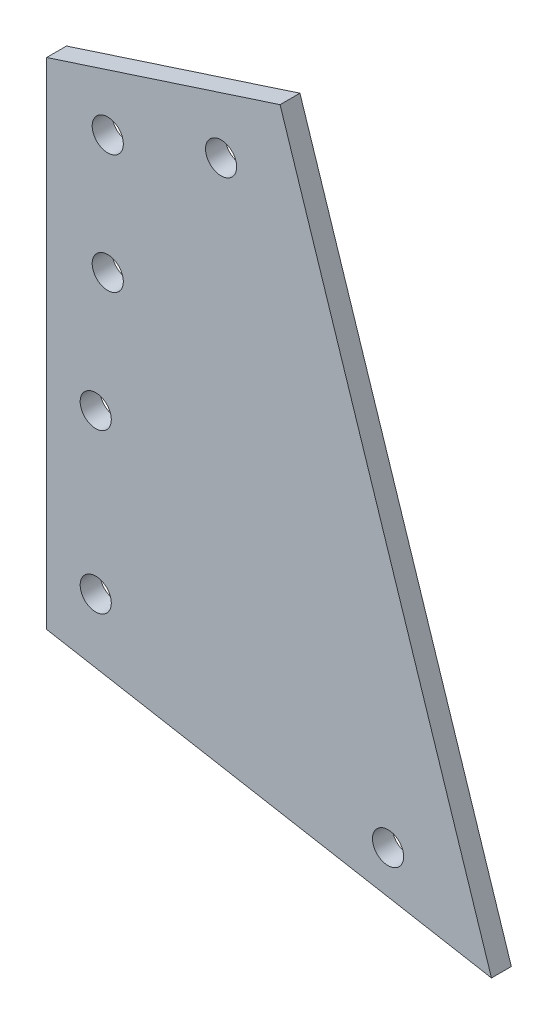
ISO-10303-21;
HEADER;
FILE_DESCRIPTION(('STEP AP214'),'2;1');
FILE_NAME('part.step','',(''),(''),'','','');
FILE_SCHEMA(('AUTOMOTIVE_DESIGN { 1 0 10303 214 1 1 1 1 }'));
ENDSEC;
DATA;
#1=APPLICATION_CONTEXT('core data for automotive mechanical design processes');
#2=APPLICATION_PROTOCOL_DEFINITION('international standard','automotive_design',2000,#1);
#3=PRODUCT_CONTEXT('',#1,'mechanical');
#4=PRODUCT('Part','Part','',(#3));
#5=PRODUCT_RELATED_PRODUCT_CATEGORY('part','',(#4));
#6=PRODUCT_DEFINITION_FORMATION('','',#4);
#7=PRODUCT_DEFINITION_CONTEXT('part definition',#1,'design');
#8=PRODUCT_DEFINITION('design','',#6,#7);
#9=PRODUCT_DEFINITION_SHAPE('','',#8);
#10=(LENGTH_UNIT() NAMED_UNIT(*) SI_UNIT(.MILLI.,.METRE.));
#11=(NAMED_UNIT(*) PLANE_ANGLE_UNIT() SI_UNIT($,.RADIAN.));
#12=(NAMED_UNIT(*) SI_UNIT($,.STERADIAN.) SOLID_ANGLE_UNIT());
#13=UNCERTAINTY_MEASURE_WITH_UNIT(LENGTH_MEASURE(1.E-05),#10,'distance_accuracy_value','');
#14=(GEOMETRIC_REPRESENTATION_CONTEXT(3) GLOBAL_UNCERTAINTY_ASSIGNED_CONTEXT((#13)) GLOBAL_UNIT_ASSIGNED_CONTEXT((#10,
#11,#12)) REPRESENTATION_CONTEXT('',''));
#15=CARTESIAN_POINT('',(0.,0.,0.));
#16=DIRECTION('',(0.,0.,1.));
#17=DIRECTION('',(1.,0.,0.));
#18=AXIS2_PLACEMENT_3D('',#15,#16,#17);
#19=CARTESIAN_POINT('',(42.1693063627355,295.217137728913,3.175));
#20=DIRECTION('',(0.309016994375065,-0.951056516295115,0.));
#21=DIRECTION('',(0.951056516295115,0.309016994375065,0.));
#22=AXIS2_PLACEMENT_3D('',#19,#20,#21);
#23=PLANE('',#22);
#24=DIRECTION('',(-0.951056516295115,-0.309016994375065,0.));
#25=VECTOR('',#24,1.);
#26=CARTESIAN_POINT('',(42.1693063627355,295.217137728913,0.));
#27=LINE('',#26,#25);
#28=CARTESIAN_POINT('',(42.1693063627355,295.217137728913,0.));
#29=VERTEX_POINT('',#28);
#30=CARTESIAN_POINT('',(4.85420955230369,283.092727808361,0.));
#31=VERTEX_POINT('',#30);
#32=EDGE_CURVE('E100',#29,#31,#27,.T.);
#33=ORIENTED_EDGE('',*,*,#32,.T.);
#34=DIRECTION('',(0.,0.,-1.));
#35=VECTOR('',#34,1.);
#36=CARTESIAN_POINT('',(4.85420955230369,283.092727808361,3.175));
#37=LINE('',#36,#35);
#38=CARTESIAN_POINT('',(4.85420955230369,283.092727808361,3.175));
#39=VERTEX_POINT('',#38);
#40=EDGE_CURVE('E11',#39,#31,#37,.T.);
#41=ORIENTED_EDGE('',*,*,#40,.F.);
#42=DIRECTION('',(-0.951056516295115,-0.309016994375065,0.));
#43=VECTOR('',#42,1.);
#44=CARTESIAN_POINT('',(42.1693063627355,295.217137728913,3.175));
#45=LINE('',#44,#43);
#46=CARTESIAN_POINT('',(42.1693063627355,295.217137728913,3.175));
#47=VERTEX_POINT('',#46);
#48=EDGE_CURVE('E88',#47,#39,#45,.T.);
#49=ORIENTED_EDGE('',*,*,#48,.F.);
#50=DIRECTION('',(0.,0.,-1.));
#51=VECTOR('',#50,1.);
#52=CARTESIAN_POINT('',(42.1693063627355,295.217137728913,3.175));
#53=LINE('',#52,#51);
#54=EDGE_CURVE('E96',#47,#29,#53,.T.);
#55=ORIENTED_EDGE('',*,*,#54,.T.);
#56=EDGE_LOOP('',(#33,#41,#49,#55));
#57=FACE_BOUND('',#56,.T.);
#58=ADVANCED_FACE('F37',(#57),#23,.F.);
#59=CARTESIAN_POINT('',(4.85420955230369,283.092727808361,3.175));
#60=DIRECTION('',(1.,0.,0.));
#61=DIRECTION('',(0.,1.,0.));
#62=AXIS2_PLACEMENT_3D('',#59,#60,#61);
#63=PLANE('',#62);
#64=DIRECTION('',(0.,-1.,0.));
#65=VECTOR('',#64,1.);
#66=CARTESIAN_POINT('',(4.85420955230369,283.092727808361,0.));
#67=LINE('',#66,#65);
#68=CARTESIAN_POINT('',(4.8542095523037,203.901454103905,0.));
#69=VERTEX_POINT('',#68);
#70=EDGE_CURVE('E92',#31,#69,#67,.T.);
#71=ORIENTED_EDGE('',*,*,#70,.T.);
#72=DIRECTION('',(0.,0.,-1.));
#73=VECTOR('',#72,1.);
#74=CARTESIAN_POINT('',(4.8542095523037,203.901454103905,3.175));
#75=LINE('',#74,#73);
#76=CARTESIAN_POINT('',(4.8542095523037,203.901454103905,3.175));
#77=VERTEX_POINT('',#76);
#78=EDGE_CURVE('E45',#77,#69,#75,.T.);
#79=ORIENTED_EDGE('',*,*,#78,.F.);
#80=DIRECTION('',(0.,-1.,0.));
#81=VECTOR('',#80,1.);
#82=CARTESIAN_POINT('',(4.85420955230369,283.092727808361,3.175));
#83=LINE('',#82,#81);
#84=EDGE_CURVE('E83',#39,#77,#83,.T.);
#85=ORIENTED_EDGE('',*,*,#84,.F.);
#86=ORIENTED_EDGE('',*,*,#40,.T.);
#87=EDGE_LOOP('',(#71,#79,#85,#86));
#88=FACE_BOUND('',#87,.T.);
#89=ADVANCED_FACE('F91',(#88),#63,.F.);
#90=CARTESIAN_POINT('',(4.8542095523037,203.901454103905,3.175));
#91=DIRECTION('',(0.17581018406846,0.984424085025257,0.));
#92=DIRECTION('',(-0.984424085025257,0.17581018406846,0.));
#93=AXIS2_PLACEMENT_3D('',#90,#91,#92);
#94=PLANE('',#93);
#95=DIRECTION('',(0.984424085025257,-0.17581018406846,0.));
#96=VECTOR('',#95,1.);
#97=CARTESIAN_POINT('',(4.8542095523037,203.901454103905,0.));
#98=LINE('',#97,#96);
#99=CARTESIAN_POINT('',(75.9660506896394,191.201454103924,0.));
#100=VERTEX_POINT('',#99);
#101=EDGE_CURVE('E70',#69,#100,#98,.T.);
#102=ORIENTED_EDGE('',*,*,#101,.T.);
#103=DIRECTION('',(0.,0.,-1.));
#104=VECTOR('',#103,1.);
#105=CARTESIAN_POINT('',(75.9660506896394,191.201454103924,3.175));
#106=LINE('',#105,#104);
#107=CARTESIAN_POINT('',(75.9660506896394,191.201454103924,3.175));
#108=VERTEX_POINT('',#107);
#109=EDGE_CURVE('E93',#108,#100,#106,.T.);
#110=ORIENTED_EDGE('',*,*,#109,.F.);
#111=DIRECTION('',(0.984424085025257,-0.17581018406846,0.));
#112=VECTOR('',#111,1.);
#113=CARTESIAN_POINT('',(4.8542095523037,203.901454103905,3.175));
#114=LINE('',#113,#112);
#115=EDGE_CURVE('E86',#77,#108,#114,.T.);
#116=ORIENTED_EDGE('',*,*,#115,.F.);
#117=ORIENTED_EDGE('',*,*,#78,.T.);
#118=EDGE_LOOP('',(#102,#110,#116,#117));
#119=FACE_BOUND('',#118,.T.);
#120=ADVANCED_FACE('F94',(#119),#94,.F.);
#121=CARTESIAN_POINT('',(75.9660506896394,191.201454103924,3.175));
#122=DIRECTION('',(-0.951056516295116,-0.309016994375065,0.));
#123=DIRECTION('',(0.309016994375065,-0.951056516295116,0.));
#124=AXIS2_PLACEMENT_3D('',#121,#122,#123);
#125=PLANE('',#124);
#126=DIRECTION('',(-0.309016994375065,0.951056516295115,0.));
#127=VECTOR('',#126,1.);
#128=CARTESIAN_POINT('',(75.9660506896394,191.201454103924,0.));
#129=LINE('',#128,#127);
#130=EDGE_CURVE('E76',#100,#29,#129,.T.);
#131=ORIENTED_EDGE('',*,*,#130,.T.);
#132=ORIENTED_EDGE('',*,*,#54,.F.);
#133=DIRECTION('',(-0.309016994375065,0.951056516295115,0.));
#134=VECTOR('',#133,1.);
#135=CARTESIAN_POINT('',(75.9660506896394,191.201454103924,3.175));
#136=LINE('',#135,#134);
#137=EDGE_CURVE('E53',#108,#47,#136,.T.);
#138=ORIENTED_EDGE('',*,*,#137,.F.);
#139=ORIENTED_EDGE('',*,*,#109,.T.);
#140=EDGE_LOOP('',(#131,#132,#138,#139));
#141=FACE_BOUND('',#140,.T.);
#142=ADVANCED_FACE('F108',(#141),#125,.F.);
#143=CARTESIAN_POINT('',(0.,0.,3.175));
#144=DIRECTION('',(0.,0.,-1.));
#145=DIRECTION('',(-1.,0.,0.));
#146=AXIS2_PLACEMENT_3D('',#143,#144,#145);
#147=PLANE('',#146);
#148=CARTESIAN_POINT('',(32.7402519463279,283.138719962978,3.175));
#149=DIRECTION('',(0.,0.,1.));
#150=DIRECTION('',(1.,0.,0.));
#151=AXIS2_PLACEMENT_3D('',#148,#149,#150);
#152=CIRCLE('',#151,2.48919999999999);
#153=CARTESIAN_POINT('',(35.2294519463279,283.138719962978,3.175));
#154=VERTEX_POINT('',#153);
#155=EDGE_CURVE('E146',#154,#154,#152,.T.);
#156=ORIENTED_EDGE('',*,*,#155,.F.);
#157=EDGE_LOOP('',(#156));
#158=FACE_BOUND('',#157,.T.);
#159=CARTESIAN_POINT('',(59.4351547545116,200.980257063771,3.175));
#160=DIRECTION('',(0.,0.,1.));
#161=DIRECTION('',(1.,0.,0.));
#162=AXIS2_PLACEMENT_3D('',#159,#160,#161);
#163=CIRCLE('',#162,2.48919999999999);
#164=CARTESIAN_POINT('',(61.9243547545116,200.980257063771,3.175));
#165=VERTEX_POINT('',#164);
#166=EDGE_CURVE('E140',#165,#165,#163,.T.);
#167=ORIENTED_EDGE('',*,*,#166,.F.);
#168=EDGE_LOOP('',(#167));
#169=FACE_BOUND('',#168,.T.);
#170=CARTESIAN_POINT('',(12.6999999999999,238.124999999999,3.175));
#171=DIRECTION('',(0.,0.,1.));
#172=DIRECTION('',(1.,0.,0.));
#173=AXIS2_PLACEMENT_3D('',#170,#171,#172);
#174=CIRCLE('',#173,2.48919999999999);
#175=CARTESIAN_POINT('',(15.1891999999999,238.124999999999,3.175));
#176=VERTEX_POINT('',#175);
#177=EDGE_CURVE('E134',#176,#176,#174,.T.);
#178=ORIENTED_EDGE('',*,*,#177,.F.);
#179=EDGE_LOOP('',(#178));
#180=FACE_BOUND('',#179,.T.);
#181=CARTESIAN_POINT('',(12.6999999999999,212.724999999999,3.175));
#182=DIRECTION('',(0.,0.,1.));
#183=DIRECTION('',(1.,0.,0.));
#184=AXIS2_PLACEMENT_3D('',#181,#182,#183);
#185=CIRCLE('',#184,2.48919999999999);
#186=CARTESIAN_POINT('',(15.1891999999999,212.724999999999,3.175));
#187=VERTEX_POINT('',#186);
#188=EDGE_CURVE('E128',#187,#187,#185,.T.);
#189=ORIENTED_EDGE('',*,*,#188,.F.);
#190=EDGE_LOOP('',(#189));
#191=FACE_BOUND('',#190,.T.);
#192=CARTESIAN_POINT('',(14.6226253109059,277.251946220133,3.175));
#193=DIRECTION('',(0.,0.,1.));
#194=DIRECTION('',(1.,0.,0.));
#195=AXIS2_PLACEMENT_3D('',#192,#193,#194);
#196=CIRCLE('',#195,2.48919999999999);
#197=CARTESIAN_POINT('',(17.1118253109059,277.251946220133,3.175));
#198=VERTEX_POINT('',#197);
#199=EDGE_CURVE('E122',#198,#198,#196,.T.);
#200=ORIENTED_EDGE('',*,*,#199,.F.);
#201=EDGE_LOOP('',(#200));
#202=FACE_BOUND('',#201,.T.);
#203=CARTESIAN_POINT('',(14.6226253109059,258.201946220132,3.175));
#204=DIRECTION('',(0.,0.,1.));
#205=DIRECTION('',(1.,0.,0.));
#206=AXIS2_PLACEMENT_3D('',#203,#204,#205);
#207=CIRCLE('',#206,2.48919999999999);
#208=CARTESIAN_POINT('',(17.1118253109059,258.201946220132,3.175));
#209=VERTEX_POINT('',#208);
#210=EDGE_CURVE('E116',#209,#209,#207,.T.);
#211=ORIENTED_EDGE('',*,*,#210,.F.);
#212=EDGE_LOOP('',(#211));
#213=FACE_BOUND('',#212,.T.);
#214=ORIENTED_EDGE('',*,*,#48,.T.);
#215=ORIENTED_EDGE('',*,*,#84,.T.);
#216=ORIENTED_EDGE('',*,*,#115,.T.);
#217=ORIENTED_EDGE('',*,*,#137,.T.);
#218=EDGE_LOOP('',(#214,#215,#216,#217));
#219=FACE_BOUND('',#218,.T.);
#220=ADVANCED_FACE('F84',(#158,#169,#180,#191,#202,#213,#219),#147,.F.);
#221=CARTESIAN_POINT('',(0.,0.,0.));
#222=DIRECTION('',(0.,0.,-1.));
#223=DIRECTION('',(-1.,0.,0.));
#224=AXIS2_PLACEMENT_3D('',#221,#222,#223);
#225=PLANE('',#224);
#226=CARTESIAN_POINT('',(32.7402519463279,283.138719962978,0.));
#227=DIRECTION('',(0.,0.,1.));
#228=DIRECTION('',(1.,0.,0.));
#229=AXIS2_PLACEMENT_3D('',#226,#227,#228);
#230=CIRCLE('',#229,2.4892);
#231=CARTESIAN_POINT('',(35.2294519463279,283.138719962978,0.));
#232=VERTEX_POINT('',#231);
#233=EDGE_CURVE('E143',#232,#232,#230,.T.);
#234=ORIENTED_EDGE('',*,*,#233,.T.);
#235=EDGE_LOOP('',(#234));
#236=FACE_BOUND('',#235,.T.);
#237=CARTESIAN_POINT('',(59.4351547545116,200.980257063771,0.));
#238=DIRECTION('',(0.,0.,1.));
#239=DIRECTION('',(1.,0.,0.));
#240=AXIS2_PLACEMENT_3D('',#237,#238,#239);
#241=CIRCLE('',#240,2.4892);
#242=CARTESIAN_POINT('',(61.9243547545116,200.980257063771,0.));
#243=VERTEX_POINT('',#242);
#244=EDGE_CURVE('E137',#243,#243,#241,.T.);
#245=ORIENTED_EDGE('',*,*,#244,.T.);
#246=EDGE_LOOP('',(#245));
#247=FACE_BOUND('',#246,.T.);
#248=CARTESIAN_POINT('',(12.6999999999999,238.124999999999,0.));
#249=DIRECTION('',(0.,0.,1.));
#250=DIRECTION('',(1.,0.,0.));
#251=AXIS2_PLACEMENT_3D('',#248,#249,#250);
#252=CIRCLE('',#251,2.4892);
#253=CARTESIAN_POINT('',(15.1891999999999,238.124999999999,0.));
#254=VERTEX_POINT('',#253);
#255=EDGE_CURVE('E131',#254,#254,#252,.T.);
#256=ORIENTED_EDGE('',*,*,#255,.T.);
#257=EDGE_LOOP('',(#256));
#258=FACE_BOUND('',#257,.T.);
#259=CARTESIAN_POINT('',(12.6999999999999,212.724999999999,0.));
#260=DIRECTION('',(0.,0.,1.));
#261=DIRECTION('',(1.,0.,0.));
#262=AXIS2_PLACEMENT_3D('',#259,#260,#261);
#263=CIRCLE('',#262,2.4892);
#264=CARTESIAN_POINT('',(15.1891999999999,212.724999999999,0.));
#265=VERTEX_POINT('',#264);
#266=EDGE_CURVE('E125',#265,#265,#263,.T.);
#267=ORIENTED_EDGE('',*,*,#266,.T.);
#268=EDGE_LOOP('',(#267));
#269=FACE_BOUND('',#268,.T.);
#270=CARTESIAN_POINT('',(14.6226253109059,277.251946220133,0.));
#271=DIRECTION('',(0.,0.,1.));
#272=DIRECTION('',(1.,0.,0.));
#273=AXIS2_PLACEMENT_3D('',#270,#271,#272);
#274=CIRCLE('',#273,2.4892);
#275=CARTESIAN_POINT('',(17.1118253109059,277.251946220133,0.));
#276=VERTEX_POINT('',#275);
#277=EDGE_CURVE('E119',#276,#276,#274,.T.);
#278=ORIENTED_EDGE('',*,*,#277,.T.);
#279=EDGE_LOOP('',(#278));
#280=FACE_BOUND('',#279,.T.);
#281=CARTESIAN_POINT('',(14.6226253109059,258.201946220132,0.));
#282=DIRECTION('',(0.,0.,1.));
#283=DIRECTION('',(1.,0.,0.));
#284=AXIS2_PLACEMENT_3D('',#281,#282,#283);
#285=CIRCLE('',#284,2.4892);
#286=CARTESIAN_POINT('',(17.1118253109059,258.201946220132,0.));
#287=VERTEX_POINT('',#286);
#288=EDGE_CURVE('E103',#287,#287,#285,.T.);
#289=ORIENTED_EDGE('',*,*,#288,.T.);
#290=EDGE_LOOP('',(#289));
#291=FACE_BOUND('',#290,.T.);
#292=ORIENTED_EDGE('',*,*,#32,.F.);
#293=ORIENTED_EDGE('',*,*,#130,.F.);
#294=ORIENTED_EDGE('',*,*,#101,.F.);
#295=ORIENTED_EDGE('',*,*,#70,.F.);
#296=EDGE_LOOP('',(#292,#293,#294,#295));
#297=FACE_BOUND('',#296,.T.);
#298=ADVANCED_FACE('F111',(#236,#247,#258,#269,#280,#291,#297),#225,.T.);
#299=CARTESIAN_POINT('',(14.6226253109059,258.201946220132,3.175));
#300=DIRECTION('',(0.,0.,1.));
#301=DIRECTION('',(1.,0.,0.));
#302=AXIS2_PLACEMENT_3D('',#299,#300,#301);
#303=CYLINDRICAL_SURFACE('',#302,2.4892);
#304=ORIENTED_EDGE('',*,*,#288,.F.);
#305=EDGE_LOOP('',(#304));
#306=FACE_BOUND('',#305,.T.);
#307=ORIENTED_EDGE('',*,*,#210,.T.);
#308=EDGE_LOOP('',(#307));
#309=FACE_BOUND('',#308,.T.);
#310=ADVANCED_FACE('F165',(#306,#309),#303,.F.);
#311=CARTESIAN_POINT('',(14.6226253109059,277.251946220133,3.175));
#312=DIRECTION('',(0.,0.,1.));
#313=DIRECTION('',(1.,0.,0.));
#314=AXIS2_PLACEMENT_3D('',#311,#312,#313);
#315=CYLINDRICAL_SURFACE('',#314,2.48919999999999);
#316=ORIENTED_EDGE('',*,*,#277,.F.);
#317=EDGE_LOOP('',(#316));
#318=FACE_BOUND('',#317,.T.);
#319=ORIENTED_EDGE('',*,*,#199,.T.);
#320=EDGE_LOOP('',(#319));
#321=FACE_BOUND('',#320,.T.);
#322=ADVANCED_FACE('F167',(#318,#321),#315,.F.);
#323=CARTESIAN_POINT('',(12.6999999999999,212.724999999999,3.175));
#324=DIRECTION('',(0.,0.,1.));
#325=DIRECTION('',(1.,0.,0.));
#326=AXIS2_PLACEMENT_3D('',#323,#324,#325);
#327=CYLINDRICAL_SURFACE('',#326,2.48919999999999);
#328=ORIENTED_EDGE('',*,*,#266,.F.);
#329=EDGE_LOOP('',(#328));
#330=FACE_BOUND('',#329,.T.);
#331=ORIENTED_EDGE('',*,*,#188,.T.);
#332=EDGE_LOOP('',(#331));
#333=FACE_BOUND('',#332,.T.);
#334=ADVANCED_FACE('F174',(#330,#333),#327,.F.);
#335=CARTESIAN_POINT('',(12.6999999999999,238.124999999999,3.175));
#336=DIRECTION('',(0.,0.,1.));
#337=DIRECTION('',(1.,0.,0.));
#338=AXIS2_PLACEMENT_3D('',#335,#336,#337);
#339=CYLINDRICAL_SURFACE('',#338,2.48919999999999);
#340=ORIENTED_EDGE('',*,*,#255,.F.);
#341=EDGE_LOOP('',(#340));
#342=FACE_BOUND('',#341,.T.);
#343=ORIENTED_EDGE('',*,*,#177,.T.);
#344=EDGE_LOOP('',(#343));
#345=FACE_BOUND('',#344,.T.);
#346=ADVANCED_FACE('F224',(#342,#345),#339,.F.);
#347=CARTESIAN_POINT('',(59.4351547545116,200.980257063771,3.175));
#348=DIRECTION('',(0.,0.,1.));
#349=DIRECTION('',(1.,0.,0.));
#350=AXIS2_PLACEMENT_3D('',#347,#348,#349);
#351=CYLINDRICAL_SURFACE('',#350,2.48919999999999);
#352=ORIENTED_EDGE('',*,*,#244,.F.);
#353=EDGE_LOOP('',(#352));
#354=FACE_BOUND('',#353,.T.);
#355=ORIENTED_EDGE('',*,*,#166,.T.);
#356=EDGE_LOOP('',(#355));
#357=FACE_BOUND('',#356,.T.);
#358=ADVANCED_FACE('F235',(#354,#357),#351,.F.);
#359=CARTESIAN_POINT('',(32.7402519463279,283.138719962978,3.175));
#360=DIRECTION('',(0.,0.,1.));
#361=DIRECTION('',(1.,0.,0.));
#362=AXIS2_PLACEMENT_3D('',#359,#360,#361);
#363=CYLINDRICAL_SURFACE('',#362,2.48919999999999);
#364=ORIENTED_EDGE('',*,*,#233,.F.);
#365=EDGE_LOOP('',(#364));
#366=FACE_BOUND('',#365,.T.);
#367=ORIENTED_EDGE('',*,*,#155,.T.);
#368=EDGE_LOOP('',(#367));
#369=FACE_BOUND('',#368,.T.);
#370=ADVANCED_FACE('F150',(#366,#369),#363,.F.);
#371=CLOSED_SHELL('',(#58,#89,#120,#142,#220,#298,#310,#322,#334,#346,#358,#370));
#372=MANIFOLD_SOLID_BREP('B2',#371);
#373=ADVANCED_BREP_SHAPE_REPRESENTATION('',(#18,#372),#14);
#374=SHAPE_DEFINITION_REPRESENTATION(#9,#373);
ENDSEC;
END-ISO-10303-21;
